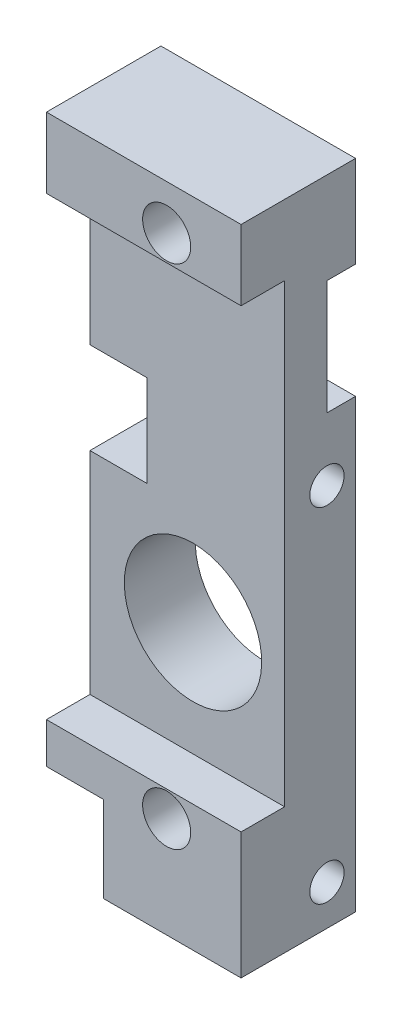
ISO-10303-21;
HEADER;
FILE_DESCRIPTION(('STEP AP214'),'2;1');
FILE_NAME('part.step','',(''),(''),'','','');
FILE_SCHEMA(('AUTOMOTIVE_DESIGN { 1 0 10303 214 1 1 1 1 }'));
ENDSEC;
DATA;
#1=APPLICATION_CONTEXT('core data for automotive mechanical design processes');
#2=APPLICATION_PROTOCOL_DEFINITION('international standard','automotive_design',2000,#1);
#3=PRODUCT_CONTEXT('',#1,'mechanical');
#4=PRODUCT('Part','Part','',(#3));
#5=PRODUCT_RELATED_PRODUCT_CATEGORY('part','',(#4));
#6=PRODUCT_DEFINITION_FORMATION('','',#4);
#7=PRODUCT_DEFINITION_CONTEXT('part definition',#1,'design');
#8=PRODUCT_DEFINITION('design','',#6,#7);
#9=PRODUCT_DEFINITION_SHAPE('','',#8);
#10=(LENGTH_UNIT() NAMED_UNIT(*) SI_UNIT(.MILLI.,.METRE.));
#11=(NAMED_UNIT(*) PLANE_ANGLE_UNIT() SI_UNIT($,.RADIAN.));
#12=(NAMED_UNIT(*) SI_UNIT($,.STERADIAN.) SOLID_ANGLE_UNIT());
#13=UNCERTAINTY_MEASURE_WITH_UNIT(LENGTH_MEASURE(1.E-05),#10,'distance_accuracy_value','');
#14=(GEOMETRIC_REPRESENTATION_CONTEXT(3) GLOBAL_UNCERTAINTY_ASSIGNED_CONTEXT((#13)) GLOBAL_UNIT_ASSIGNED_CONTEXT((#10,
#11,#12)) REPRESENTATION_CONTEXT('',''));
#15=CARTESIAN_POINT('',(0.,0.,0.));
#16=DIRECTION('',(0.,0.,1.));
#17=DIRECTION('',(1.,0.,0.));
#18=AXIS2_PLACEMENT_3D('',#15,#16,#17);
#19=CARTESIAN_POINT('',(-9.,36.,-2.49999999999999));
#20=DIRECTION('',(0.,0.,-1.));
#21=DIRECTION('',(0.,1.,0.));
#22=AXIS2_PLACEMENT_3D('',#19,#20,#21);
#23=PLANE('',#22);
#24=CARTESIAN_POINT('',(1.5,-12.2,-2.5));
#25=DIRECTION('',(0.,0.,-1.));
#26=DIRECTION('',(0.,1.,0.));
#27=AXIS2_PLACEMENT_3D('',#24,#25,#26);
#28=CIRCLE('',#27,3.5);
#29=CARTESIAN_POINT('',(1.5,-8.7,-2.5));
#30=VERTEX_POINT('',#29);
#31=EDGE_CURVE('E380',#30,#30,#28,.T.);
#32=ORIENTED_EDGE('',*,*,#31,.F.);
#33=EDGE_LOOP('',(#32));
#34=FACE_BOUND('',#33,.T.);
#35=DIRECTION('',(1.,0.,0.));
#36=VECTOR('',#35,1.);
#37=CARTESIAN_POINT('',(-9.,17.9999999999999,-2.5));
#38=LINE('',#37,#36);
#39=CARTESIAN_POINT('',(-9.,17.9999999999999,-2.5));
#40=VERTEX_POINT('',#39);
#41=CARTESIAN_POINT('',(8.,17.9999999999999,-2.5));
#42=VERTEX_POINT('',#41);
#43=EDGE_CURVE('E304',#40,#42,#38,.T.);
#44=ORIENTED_EDGE('',*,*,#43,.T.);
#45=DIRECTION('',(0.,1.,0.));
#46=VECTOR('',#45,1.);
#47=CARTESIAN_POINT('',(8.,36.,-2.49999999999999));
#48=LINE('',#47,#46);
#49=CARTESIAN_POINT('',(8.,-21.,-2.5));
#50=VERTEX_POINT('',#49);
#51=EDGE_CURVE('E252',#50,#42,#48,.T.);
#52=ORIENTED_EDGE('',*,*,#51,.F.);
#53=DIRECTION('',(1.,0.,0.));
#54=VECTOR('',#53,1.);
#55=CARTESIAN_POINT('',(-9.,-21.,-2.5));
#56=LINE('',#55,#54);
#57=CARTESIAN_POINT('',(-4.,-21.,-2.5));
#58=VERTEX_POINT('',#57);
#59=EDGE_CURVE('E197',#58,#50,#56,.T.);
#60=ORIENTED_EDGE('',*,*,#59,.F.);
#61=DIRECTION('',(0.,-1.,0.));
#62=VECTOR('',#61,1.);
#63=CARTESIAN_POINT('',(-4.,-13.5,-2.5));
#64=LINE('',#63,#62);
#65=CARTESIAN_POINT('',(-4.,-13.5,-2.5));
#66=VERTEX_POINT('',#65);
#67=EDGE_CURVE('E320',#66,#58,#64,.T.);
#68=ORIENTED_EDGE('',*,*,#67,.F.);
#69=DIRECTION('',(1.,0.,0.));
#70=VECTOR('',#69,1.);
#71=CARTESIAN_POINT('',(-4.,-13.5,-2.5));
#72=LINE('',#71,#70);
#73=CARTESIAN_POINT('',(-9.,-13.5,-2.5));
#74=VERTEX_POINT('',#73);
#75=EDGE_CURVE('E223',#74,#66,#72,.T.);
#76=ORIENTED_EDGE('',*,*,#75,.F.);
#77=DIRECTION('',(0.,1.,0.));
#78=VECTOR('',#77,1.);
#79=CARTESIAN_POINT('',(-9.,36.,-2.49999999999999));
#80=LINE('',#79,#78);
#81=CARTESIAN_POINT('',(-9.,8.5,-2.5));
#82=VERTEX_POINT('',#81);
#83=EDGE_CURVE('E182',#74,#82,#80,.T.);
#84=ORIENTED_EDGE('',*,*,#83,.T.);
#85=DIRECTION('',(-1.,0.,0.));
#86=VECTOR('',#85,1.);
#87=CARTESIAN_POINT('',(-4.,8.5,-2.5));
#88=LINE('',#87,#86);
#89=CARTESIAN_POINT('',(-4.,8.5,-2.5));
#90=VERTEX_POINT('',#89);
#91=EDGE_CURVE('E213',#90,#82,#88,.T.);
#92=ORIENTED_EDGE('',*,*,#91,.F.);
#93=DIRECTION('',(0.,-1.,0.));
#94=VECTOR('',#93,1.);
#95=CARTESIAN_POINT('',(-4.,16.5,-2.49999999999999));
#96=LINE('',#95,#94);
#97=CARTESIAN_POINT('',(-4.,16.5,-2.49999999999999));
#98=VERTEX_POINT('',#97);
#99=EDGE_CURVE('E208',#98,#90,#96,.T.);
#100=ORIENTED_EDGE('',*,*,#99,.F.);
#101=DIRECTION('',(1.,0.,0.));
#102=VECTOR('',#101,1.);
#103=CARTESIAN_POINT('',(-4.,16.5,-2.49999999999999));
#104=LINE('',#103,#102);
#105=CARTESIAN_POINT('',(-9.,16.5,-2.49999999999999));
#106=VERTEX_POINT('',#105);
#107=EDGE_CURVE('E230',#106,#98,#104,.T.);
#108=ORIENTED_EDGE('',*,*,#107,.F.);
#109=EDGE_CURVE('E179',#106,#40,#80,.T.);
#110=ORIENTED_EDGE('',*,*,#109,.T.);
#111=EDGE_LOOP('',(#44,#52,#60,#68,#76,#84,#92,#100,#108,#110));
#112=FACE_BOUND('',#111,.T.);
#113=CARTESIAN_POINT('',(0.,0.,-2.5));
#114=DIRECTION('',(0.,0.,-1.));
#115=DIRECTION('',(0.,1.,0.));
#116=AXIS2_PLACEMENT_3D('',#113,#114,#115);
#117=CIRCLE('',#116,6.00000000001402);
#118=CARTESIAN_POINT('',(0.,6.00000000001394,-2.5));
#119=VERTEX_POINT('',#118);
#120=EDGE_CURVE('E321',#119,#119,#117,.T.);
#121=ORIENTED_EDGE('',*,*,#120,.F.);
#122=EDGE_LOOP('',(#121));
#123=FACE_BOUND('',#122,.T.);
#124=ADVANCED_FACE('F30',(#34,#112,#123),#23,.T.);
#125=CARTESIAN_POINT('',(-9.,36.,7.50000000000001));
#126=DIRECTION('',(0.,0.,1.));
#127=DIRECTION('',(0.,-1.,0.));
#128=AXIS2_PLACEMENT_3D('',#125,#126,#127);
#129=PLANE('',#128);
#130=CARTESIAN_POINT('',(1.5,32.0999999999999,7.50000000000002));
#131=DIRECTION('',(0.,0.,-1.));
#132=DIRECTION('',(0.,1.,0.));
#133=AXIS2_PLACEMENT_3D('',#130,#131,#132);
#134=CIRCLE('',#133,2.1);
#135=CARTESIAN_POINT('',(1.5,34.1999999999999,7.50000000000002));
#136=VERTEX_POINT('',#135);
#137=EDGE_CURVE('E357',#136,#136,#134,.T.);
#138=ORIENTED_EDGE('',*,*,#137,.T.);
#139=EDGE_LOOP('',(#138));
#140=FACE_BOUND('',#139,.T.);
#141=DIRECTION('',(1.,0.,0.));
#142=VECTOR('',#141,1.);
#143=CARTESIAN_POINT('',(-9.,29.8499999999984,7.50000000000001));
#144=LINE('',#143,#142);
#145=CARTESIAN_POINT('',(-9.,29.8499999999984,7.50000000000001));
#146=VERTEX_POINT('',#145);
#147=CARTESIAN_POINT('',(8.,29.8499999999984,7.50000000000001));
#148=VERTEX_POINT('',#147);
#149=EDGE_CURVE('E335',#146,#148,#144,.T.);
#150=ORIENTED_EDGE('',*,*,#149,.T.);
#151=DIRECTION('',(0.,-1.,0.));
#152=VECTOR('',#151,1.);
#153=CARTESIAN_POINT('',(8.,36.,7.50000000000001));
#154=LINE('',#153,#152);
#155=CARTESIAN_POINT('',(8.,36.,7.50000000000001));
#156=VERTEX_POINT('',#155);
#157=EDGE_CURVE('E246',#156,#148,#154,.T.);
#158=ORIENTED_EDGE('',*,*,#157,.F.);
#159=DIRECTION('',(1.,0.,0.));
#160=VECTOR('',#159,1.);
#161=CARTESIAN_POINT('',(-9.,36.,7.50000000000001));
#162=LINE('',#161,#160);
#163=CARTESIAN_POINT('',(-9.,36.,7.50000000000001));
#164=VERTEX_POINT('',#163);
#165=EDGE_CURVE('E11',#164,#156,#162,.T.);
#166=ORIENTED_EDGE('',*,*,#165,.F.);
#167=DIRECTION('',(0.,-1.,0.));
#168=VECTOR('',#167,1.);
#169=CARTESIAN_POINT('',(-9.,36.,7.50000000000001));
#170=LINE('',#169,#168);
#171=EDGE_CURVE('E180',#164,#146,#170,.T.);
#172=ORIENTED_EDGE('',*,*,#171,.T.);
#173=EDGE_LOOP('',(#150,#158,#166,#172));
#174=FACE_BOUND('',#173,.T.);
#175=ADVANCED_FACE('F387',(#140,#174),#129,.T.);
#176=CARTESIAN_POINT('',(-9.,-21.,7.5));
#177=DIRECTION('',(1.,0.,0.));
#178=DIRECTION('',(0.,0.,-1.));
#179=AXIS2_PLACEMENT_3D('',#176,#177,#178);
#180=PLANE('',#179);
#181=DIRECTION('',(0.,-1.,0.));
#182=VECTOR('',#181,1.);
#183=CARTESIAN_POINT('',(-9.,27.9999999999999,0.));
#184=LINE('',#183,#182);
#185=CARTESIAN_POINT('',(-9.,27.9999999999999,0.));
#186=VERTEX_POINT('',#185);
#187=CARTESIAN_POINT('',(-9.,17.9999999999999,0.));
#188=VERTEX_POINT('',#187);
#189=EDGE_CURVE('E162',#186,#188,#184,.T.);
#190=ORIENTED_EDGE('',*,*,#189,.T.);
#191=DIRECTION('',(0.,0.,-1.));
#192=VECTOR('',#191,1.);
#193=CARTESIAN_POINT('',(-9.,17.9999999999999,-2.5));
#194=LINE('',#193,#192);
#195=EDGE_CURVE('E172',#188,#40,#194,.T.);
#196=ORIENTED_EDGE('',*,*,#195,.T.);
#197=ORIENTED_EDGE('',*,*,#109,.F.);
#198=DIRECTION('',(0.,0.,-1.));
#199=VECTOR('',#198,1.);
#200=CARTESIAN_POINT('',(-9.,16.5,7.50000000000002));
#201=LINE('',#200,#199);
#202=CARTESIAN_POINT('',(-9.,16.5,3.70000000000004));
#203=VERTEX_POINT('',#202);
#204=EDGE_CURVE('E235',#203,#106,#201,.T.);
#205=ORIENTED_EDGE('',*,*,#204,.F.);
#206=DIRECTION('',(0.,1.,0.));
#207=VECTOR('',#206,1.);
#208=CARTESIAN_POINT('',(-9.,29.8499999999984,3.70000000000004));
#209=LINE('',#208,#207);
#210=CARTESIAN_POINT('',(-9.,29.8499999999984,3.70000000000004));
#211=VERTEX_POINT('',#210);
#212=EDGE_CURVE('E300',#203,#211,#209,.T.);
#213=ORIENTED_EDGE('',*,*,#212,.T.);
#214=DIRECTION('',(0.,0.,1.));
#215=VECTOR('',#214,1.);
#216=CARTESIAN_POINT('',(-9.,29.8499999999984,7.50000000000001));
#217=LINE('',#216,#215);
#218=EDGE_CURVE('E331',#211,#146,#217,.T.);
#219=ORIENTED_EDGE('',*,*,#218,.T.);
#220=ORIENTED_EDGE('',*,*,#171,.F.);
#221=DIRECTION('',(0.,0.,1.));
#222=VECTOR('',#221,1.);
#223=CARTESIAN_POINT('',(-9.,36.,7.50000000000001));
#224=LINE('',#223,#222);
#225=CARTESIAN_POINT('',(-9.,36.,-2.49999999999999));
#226=VERTEX_POINT('',#225);
#227=EDGE_CURVE('E178',#226,#164,#224,.T.);
#228=ORIENTED_EDGE('',*,*,#227,.F.);
#229=CARTESIAN_POINT('',(-9.,27.9999999999999,-2.5));
#230=VERTEX_POINT('',#229);
#231=EDGE_CURVE('E169',#230,#226,#80,.T.);
#232=ORIENTED_EDGE('',*,*,#231,.F.);
#233=DIRECTION('',(0.,0.,1.));
#234=VECTOR('',#233,1.);
#235=CARTESIAN_POINT('',(-9.,27.9999999999999,-2.5));
#236=LINE('',#235,#234);
#237=EDGE_CURVE('E155',#230,#186,#236,.T.);
#238=ORIENTED_EDGE('',*,*,#237,.T.);
#239=EDGE_LOOP('',(#190,#196,#197,#205,#213,#219,#220,#228,#232,#238));
#240=FACE_BOUND('',#239,.T.);
#241=ADVANCED_FACE('F175',(#240),#180,.F.);
#242=CARTESIAN_POINT('',(1.5,-12.2,7.50000000000001));
#243=DIRECTION('',(0.,0.,-1.));
#244=DIRECTION('',(0.,1.,0.));
#245=AXIS2_PLACEMENT_3D('',#242,#243,#244);
#246=CIRCLE('',#245,2.1);
#247=CARTESIAN_POINT('',(1.5,-10.1,7.50000000000001));
#248=VERTEX_POINT('',#247);
#249=EDGE_CURVE('E371',#248,#248,#246,.T.);
#250=ORIENTED_EDGE('',*,*,#249,.T.);
#251=EDGE_LOOP('',(#250));
#252=FACE_BOUND('',#251,.T.);
#253=DIRECTION('',(1.,0.,0.));
#254=VECTOR('',#253,1.);
#255=CARTESIAN_POINT('',(-9.,-9.95000000000155,7.50000000000001));
#256=LINE('',#255,#254);
#257=CARTESIAN_POINT('',(-9.,-9.95000000000155,7.50000000000001));
#258=VERTEX_POINT('',#257);
#259=CARTESIAN_POINT('',(8.,-9.95000000000155,7.50000000000001));
#260=VERTEX_POINT('',#259);
#261=EDGE_CURVE('E267',#258,#260,#256,.T.);
#262=ORIENTED_EDGE('',*,*,#261,.F.);
#263=CARTESIAN_POINT('',(-9.,-13.5,7.5));
#264=VERTEX_POINT('',#263);
#265=EDGE_CURVE('E185',#258,#264,#170,.T.);
#266=ORIENTED_EDGE('',*,*,#265,.T.);
#267=DIRECTION('',(1.,0.,0.));
#268=VECTOR('',#267,1.);
#269=CARTESIAN_POINT('',(-4.,-13.5,7.50000000000001));
#270=LINE('',#269,#268);
#271=CARTESIAN_POINT('',(-4.,-13.5,7.50000000000001));
#272=VERTEX_POINT('',#271);
#273=EDGE_CURVE('E227',#264,#272,#270,.T.);
#274=ORIENTED_EDGE('',*,*,#273,.T.);
#275=DIRECTION('',(0.,-1.,0.));
#276=VECTOR('',#275,1.);
#277=CARTESIAN_POINT('',(-4.,-13.5,7.50000000000001));
#278=LINE('',#277,#276);
#279=CARTESIAN_POINT('',(-4.,-21.,7.50000000000001));
#280=VERTEX_POINT('',#279);
#281=EDGE_CURVE('E273',#272,#280,#278,.T.);
#282=ORIENTED_EDGE('',*,*,#281,.T.);
#283=DIRECTION('',(1.,0.,0.));
#284=VECTOR('',#283,1.);
#285=CARTESIAN_POINT('',(-9.,-21.,7.5));
#286=LINE('',#285,#284);
#287=CARTESIAN_POINT('',(8.,-21.,7.5));
#288=VERTEX_POINT('',#287);
#289=EDGE_CURVE('E194',#280,#288,#286,.T.);
#290=ORIENTED_EDGE('',*,*,#289,.T.);
#291=EDGE_CURVE('E245',#260,#288,#154,.T.);
#292=ORIENTED_EDGE('',*,*,#291,.F.);
#293=EDGE_LOOP('',(#262,#266,#274,#282,#290,#292));
#294=FACE_BOUND('',#293,.T.);
#295=ADVANCED_FACE('F32',(#252,#294),#129,.T.);
#296=CARTESIAN_POINT('',(-9.,36.,7.50000000000001));
#297=DIRECTION('',(0.,1.,0.));
#298=DIRECTION('',(0.,0.,1.));
#299=AXIS2_PLACEMENT_3D('',#296,#297,#298);
#300=PLANE('',#299);
#301=ORIENTED_EDGE('',*,*,#165,.T.);
#302=DIRECTION('',(0.,0.,1.));
#303=VECTOR('',#302,1.);
#304=CARTESIAN_POINT('',(8.,36.,7.50000000000001));
#305=LINE('',#304,#303);
#306=CARTESIAN_POINT('',(8.,36.,-2.49999999999999));
#307=VERTEX_POINT('',#306);
#308=EDGE_CURVE('E255',#307,#156,#305,.T.);
#309=ORIENTED_EDGE('',*,*,#308,.F.);
#310=DIRECTION('',(1.,0.,0.));
#311=VECTOR('',#310,1.);
#312=CARTESIAN_POINT('',(-9.,36.,-2.49999999999999));
#313=LINE('',#312,#311);
#314=EDGE_CURVE('E39',#226,#307,#313,.T.);
#315=ORIENTED_EDGE('',*,*,#314,.F.);
#316=ORIENTED_EDGE('',*,*,#227,.T.);
#317=EDGE_LOOP('',(#301,#309,#315,#316));
#318=FACE_BOUND('',#317,.T.);
#319=ADVANCED_FACE('F395',(#318),#300,.T.);
#320=CARTESIAN_POINT('',(1.5,32.0999999999999,-2.49999999999999));
#321=DIRECTION('',(0.,0.,-1.));
#322=DIRECTION('',(0.,1.,0.));
#323=AXIS2_PLACEMENT_3D('',#320,#321,#322);
#324=CIRCLE('',#323,3.5);
#325=CARTESIAN_POINT('',(1.5,35.5999999999999,-2.49999999999999));
#326=VERTEX_POINT('',#325);
#327=EDGE_CURVE('E368',#326,#326,#324,.T.);
#328=ORIENTED_EDGE('',*,*,#327,.F.);
#329=EDGE_LOOP('',(#328));
#330=FACE_BOUND('',#329,.T.);
#331=DIRECTION('',(1.,0.,0.));
#332=VECTOR('',#331,1.);
#333=CARTESIAN_POINT('',(-9.,27.9999999999999,-2.5));
#334=LINE('',#333,#332);
#335=CARTESIAN_POINT('',(8.,27.9999999999999,-2.49999999999999));
#336=VERTEX_POINT('',#335);
#337=EDGE_CURVE('E47',#230,#336,#334,.T.);
#338=ORIENTED_EDGE('',*,*,#337,.F.);
#339=ORIENTED_EDGE('',*,*,#231,.T.);
#340=ORIENTED_EDGE('',*,*,#314,.T.);
#341=EDGE_CURVE('E171',#336,#307,#48,.T.);
#342=ORIENTED_EDGE('',*,*,#341,.F.);
#343=EDGE_LOOP('',(#338,#339,#340,#342));
#344=FACE_BOUND('',#343,.T.);
#345=ADVANCED_FACE('F167',(#330,#344),#23,.T.);
#346=CARTESIAN_POINT('',(-9.,-21.,7.5));
#347=DIRECTION('',(0.,-1.,0.));
#348=DIRECTION('',(0.,0.,-1.));
#349=AXIS2_PLACEMENT_3D('',#346,#347,#348);
#350=PLANE('',#349);
#351=DIRECTION('',(0.,0.,-1.));
#352=VECTOR('',#351,1.);
#353=CARTESIAN_POINT('',(-4.,-21.,7.50000000000001));
#354=LINE('',#353,#352);
#355=EDGE_CURVE('E220',#280,#58,#354,.T.);
#356=ORIENTED_EDGE('',*,*,#355,.T.);
#357=ORIENTED_EDGE('',*,*,#59,.T.);
#358=DIRECTION('',(0.,0.,-1.));
#359=VECTOR('',#358,1.);
#360=CARTESIAN_POINT('',(8.,-21.,7.5));
#361=LINE('',#360,#359);
#362=EDGE_CURVE('E249',#288,#50,#361,.T.);
#363=ORIENTED_EDGE('',*,*,#362,.F.);
#364=ORIENTED_EDGE('',*,*,#289,.F.);
#365=EDGE_LOOP('',(#356,#357,#363,#364));
#366=FACE_BOUND('',#365,.T.);
#367=ADVANCED_FACE('F318',(#366),#350,.T.);
#368=DIRECTION('',(0.,0.,-1.));
#369=VECTOR('',#368,1.);
#370=CARTESIAN_POINT('',(-9.,-9.95000000000155,3.70000000000004));
#371=LINE('',#370,#369);
#372=CARTESIAN_POINT('',(-9.,-9.95000000000155,3.70000000000004));
#373=VERTEX_POINT('',#372);
#374=EDGE_CURVE('E340',#258,#373,#371,.T.);
#375=ORIENTED_EDGE('',*,*,#374,.T.);
#376=CARTESIAN_POINT('',(-9.,8.49999999999999,3.70000000000004));
#377=VERTEX_POINT('',#376);
#378=EDGE_CURVE('E279',#373,#377,#209,.T.);
#379=ORIENTED_EDGE('',*,*,#378,.T.);
#380=DIRECTION('',(0.,0.,-1.));
#381=VECTOR('',#380,1.);
#382=CARTESIAN_POINT('',(-9.,8.49999999999999,7.50000000000002));
#383=LINE('',#382,#381);
#384=EDGE_CURVE('E237',#377,#82,#383,.T.);
#385=ORIENTED_EDGE('',*,*,#384,.T.);
#386=ORIENTED_EDGE('',*,*,#83,.F.);
#387=DIRECTION('',(0.,0.,-1.));
#388=VECTOR('',#387,1.);
#389=CARTESIAN_POINT('',(-9.,-13.5,7.50000000000001));
#390=LINE('',#389,#388);
#391=EDGE_CURVE('E215',#264,#74,#390,.T.);
#392=ORIENTED_EDGE('',*,*,#391,.F.);
#393=ORIENTED_EDGE('',*,*,#265,.F.);
#394=EDGE_LOOP('',(#375,#379,#385,#386,#392,#393));
#395=FACE_BOUND('',#394,.T.);
#396=ADVANCED_FACE('F275',(#395),#180,.F.);
#397=CARTESIAN_POINT('',(-9.,12.5,0.));
#398=DIRECTION('',(1.,0.,0.));
#399=DIRECTION('',(0.,0.,-1.));
#400=AXIS2_PLACEMENT_3D('',#397,#398,#399);
#401=CYLINDRICAL_SURFACE('',#400,1.5);
#402=CARTESIAN_POINT('',(-4.,12.5,0.));
#403=DIRECTION('',(1.,0.,0.));
#404=DIRECTION('',(0.,0.,-1.));
#405=AXIS2_PLACEMENT_3D('',#402,#403,#404);
#406=CIRCLE('',#405,1.5);
#407=CARTESIAN_POINT('',(-4.,12.5,-1.50000000000001));
#408=VERTEX_POINT('',#407);
#409=EDGE_CURVE('E202',#408,#408,#406,.F.);
#410=ORIENTED_EDGE('',*,*,#409,.T.);
#411=EDGE_LOOP('',(#410));
#412=FACE_BOUND('',#411,.T.);
#413=CARTESIAN_POINT('',(8.,12.5,0.));
#414=DIRECTION('',(1.,0.,0.));
#415=DIRECTION('',(0.,0.,-1.));
#416=AXIS2_PLACEMENT_3D('',#413,#414,#415);
#417=CIRCLE('',#416,1.5);
#418=CARTESIAN_POINT('',(8.,12.5,-1.50000000000001));
#419=VERTEX_POINT('',#418);
#420=EDGE_CURVE('E242',#419,#419,#417,.T.);
#421=ORIENTED_EDGE('',*,*,#420,.T.);
#422=EDGE_LOOP('',(#421));
#423=FACE_BOUND('',#422,.T.);
#424=ADVANCED_FACE('F466',(#412,#423),#401,.F.);
#425=CARTESIAN_POINT('',(-9.,-17.5,0.));
#426=DIRECTION('',(1.,0.,0.));
#427=DIRECTION('',(0.,0.,-1.));
#428=AXIS2_PLACEMENT_3D('',#425,#426,#427);
#429=CYLINDRICAL_SURFACE('',#428,1.5);
#430=CARTESIAN_POINT('',(-4.,-17.5,0.));
#431=DIRECTION('',(1.,0.,0.));
#432=DIRECTION('',(0.,1.,0.));
#433=AXIS2_PLACEMENT_3D('',#430,#431,#432);
#434=CIRCLE('',#433,1.5);
#435=CARTESIAN_POINT('',(-4.,-16.,0.));
#436=VERTEX_POINT('',#435);
#437=EDGE_CURVE('E206',#436,#436,#434,.F.);
#438=ORIENTED_EDGE('',*,*,#437,.T.);
#439=EDGE_LOOP('',(#438));
#440=FACE_BOUND('',#439,.T.);
#441=CARTESIAN_POINT('',(8.,-17.5,0.));
#442=DIRECTION('',(1.,0.,0.));
#443=DIRECTION('',(0.,0.,-1.));
#444=AXIS2_PLACEMENT_3D('',#441,#442,#443);
#445=CIRCLE('',#444,1.5);
#446=CARTESIAN_POINT('',(8.,-17.5,-1.50000000000001));
#447=VERTEX_POINT('',#446);
#448=EDGE_CURVE('E204',#447,#447,#445,.T.);
#449=ORIENTED_EDGE('',*,*,#448,.T.);
#450=EDGE_LOOP('',(#449));
#451=FACE_BOUND('',#450,.T.);
#452=ADVANCED_FACE('F463',(#440,#451),#429,.F.);
#453=CARTESIAN_POINT('',(8.,-21.,7.5));
#454=DIRECTION('',(1.,0.,0.));
#455=DIRECTION('',(0.,0.,-1.));
#456=AXIS2_PLACEMENT_3D('',#453,#454,#455);
#457=PLANE('',#456);
#458=DIRECTION('',(0.,0.,-1.));
#459=VECTOR('',#458,1.);
#460=CARTESIAN_POINT('',(8.,17.9999999999999,-2.5));
#461=LINE('',#460,#459);
#462=CARTESIAN_POINT('',(8.,17.9999999999999,0.));
#463=VERTEX_POINT('',#462);
#464=EDGE_CURVE('E163',#463,#42,#461,.T.);
#465=ORIENTED_EDGE('',*,*,#464,.F.);
#466=DIRECTION('',(0.,-1.,0.));
#467=VECTOR('',#466,1.);
#468=CARTESIAN_POINT('',(8.,27.9999999999999,0.));
#469=LINE('',#468,#467);
#470=CARTESIAN_POINT('',(8.,27.9999999999999,0.));
#471=VERTEX_POINT('',#470);
#472=EDGE_CURVE('E352',#471,#463,#469,.T.);
#473=ORIENTED_EDGE('',*,*,#472,.F.);
#474=DIRECTION('',(0.,0.,1.));
#475=VECTOR('',#474,1.);
#476=CARTESIAN_POINT('',(8.,27.9999999999999,-2.5));
#477=LINE('',#476,#475);
#478=EDGE_CURVE('E355',#336,#471,#477,.T.);
#479=ORIENTED_EDGE('',*,*,#478,.F.);
#480=ORIENTED_EDGE('',*,*,#341,.T.);
#481=ORIENTED_EDGE('',*,*,#308,.T.);
#482=ORIENTED_EDGE('',*,*,#157,.T.);
#483=DIRECTION('',(0.,0.,1.));
#484=VECTOR('',#483,1.);
#485=CARTESIAN_POINT('',(8.,29.8499999999984,7.50000000000001));
#486=LINE('',#485,#484);
#487=CARTESIAN_POINT('',(8.,29.8499999999984,3.70000000000004));
#488=VERTEX_POINT('',#487);
#489=EDGE_CURVE('E338',#488,#148,#486,.T.);
#490=ORIENTED_EDGE('',*,*,#489,.F.);
#491=DIRECTION('',(0.,1.,0.));
#492=VECTOR('',#491,1.);
#493=CARTESIAN_POINT('',(8.,29.8499999999984,3.70000000000004));
#494=LINE('',#493,#492);
#495=CARTESIAN_POINT('',(8.,-9.95000000000155,3.70000000000004));
#496=VERTEX_POINT('',#495);
#497=EDGE_CURVE('E341',#496,#488,#494,.T.);
#498=ORIENTED_EDGE('',*,*,#497,.F.);
#499=DIRECTION('',(0.,0.,-1.));
#500=VECTOR('',#499,1.);
#501=CARTESIAN_POINT('',(8.,-9.95000000000155,3.70000000000004));
#502=LINE('',#501,#500);
#503=EDGE_CURVE('E307',#260,#496,#502,.T.);
#504=ORIENTED_EDGE('',*,*,#503,.F.);
#505=ORIENTED_EDGE('',*,*,#291,.T.);
#506=ORIENTED_EDGE('',*,*,#362,.T.);
#507=ORIENTED_EDGE('',*,*,#51,.T.);
#508=EDGE_LOOP('',(#465,#473,#479,#480,#481,#482,#490,#498,#504,#505,#506,#507));
#509=FACE_BOUND('',#508,.T.);
#510=ORIENTED_EDGE('',*,*,#420,.F.);
#511=EDGE_LOOP('',(#510));
#512=FACE_BOUND('',#511,.T.);
#513=ORIENTED_EDGE('',*,*,#448,.F.);
#514=EDGE_LOOP('',(#513));
#515=FACE_BOUND('',#514,.T.);
#516=ADVANCED_FACE('F311',(#509,#512,#515),#457,.T.);
#517=CARTESIAN_POINT('',(-4.,16.5,7.50000000000002));
#518=DIRECTION('',(1.,0.,0.));
#519=DIRECTION('',(0.,0.,-1.));
#520=AXIS2_PLACEMENT_3D('',#517,#518,#519);
#521=PLANE('',#520);
#522=DIRECTION('',(0.,0.,-1.));
#523=VECTOR('',#522,1.);
#524=CARTESIAN_POINT('',(-4.,8.49999999999999,7.50000000000002));
#525=LINE('',#524,#523);
#526=CARTESIAN_POINT('',(-4.,8.49999999999999,3.70000000000004));
#527=VERTEX_POINT('',#526);
#528=EDGE_CURVE('E233',#527,#90,#525,.T.);
#529=ORIENTED_EDGE('',*,*,#528,.F.);
#530=DIRECTION('',(0.,1.,0.));
#531=VECTOR('',#530,1.);
#532=CARTESIAN_POINT('',(-4.,16.5,3.70000000000004));
#533=LINE('',#532,#531);
#534=CARTESIAN_POINT('',(-4.,16.5,3.70000000000004));
#535=VERTEX_POINT('',#534);
#536=EDGE_CURVE('E55',#527,#535,#533,.T.);
#537=ORIENTED_EDGE('',*,*,#536,.T.);
#538=DIRECTION('',(0.,0.,-1.));
#539=VECTOR('',#538,1.);
#540=CARTESIAN_POINT('',(-4.,16.5,7.50000000000002));
#541=LINE('',#540,#539);
#542=EDGE_CURVE('E205',#535,#98,#541,.T.);
#543=ORIENTED_EDGE('',*,*,#542,.T.);
#544=ORIENTED_EDGE('',*,*,#99,.T.);
#545=EDGE_LOOP('',(#529,#537,#543,#544));
#546=FACE_BOUND('',#545,.T.);
#547=ORIENTED_EDGE('',*,*,#409,.F.);
#548=EDGE_LOOP('',(#547));
#549=FACE_BOUND('',#548,.T.);
#550=ADVANCED_FACE('F290',(#546,#549),#521,.F.);
#551=CARTESIAN_POINT('',(-4.,16.5,7.50000000000002));
#552=DIRECTION('',(0.,1.,0.));
#553=DIRECTION('',(0.,0.,1.));
#554=AXIS2_PLACEMENT_3D('',#551,#552,#553);
#555=PLANE('',#554);
#556=ORIENTED_EDGE('',*,*,#542,.F.);
#557=DIRECTION('',(-1.,0.,0.));
#558=VECTOR('',#557,1.);
#559=CARTESIAN_POINT('',(-4.,16.5,3.70000000000004));
#560=LINE('',#559,#558);
#561=EDGE_CURVE('E297',#535,#203,#560,.T.);
#562=ORIENTED_EDGE('',*,*,#561,.T.);
#563=ORIENTED_EDGE('',*,*,#204,.T.);
#564=ORIENTED_EDGE('',*,*,#107,.T.);
#565=EDGE_LOOP('',(#556,#562,#563,#564));
#566=FACE_BOUND('',#565,.T.);
#567=ADVANCED_FACE('F295',(#566),#555,.F.);
#568=CARTESIAN_POINT('',(-4.,8.49999999999999,7.50000000000002));
#569=DIRECTION('',(0.,-1.,0.));
#570=DIRECTION('',(0.,0.,-1.));
#571=AXIS2_PLACEMENT_3D('',#568,#569,#570);
#572=PLANE('',#571);
#573=ORIENTED_EDGE('',*,*,#384,.F.);
#574=DIRECTION('',(1.,0.,0.));
#575=VECTOR('',#574,1.);
#576=CARTESIAN_POINT('',(-4.,8.49999999999999,3.70000000000004));
#577=LINE('',#576,#575);
#578=EDGE_CURVE('E282',#377,#527,#577,.T.);
#579=ORIENTED_EDGE('',*,*,#578,.T.);
#580=ORIENTED_EDGE('',*,*,#528,.T.);
#581=ORIENTED_EDGE('',*,*,#91,.T.);
#582=EDGE_LOOP('',(#573,#579,#580,#581));
#583=FACE_BOUND('',#582,.T.);
#584=ADVANCED_FACE('F281',(#583),#572,.F.);
#585=CARTESIAN_POINT('',(-4.,-13.5,7.50000000000001));
#586=DIRECTION('',(1.,0.,0.));
#587=DIRECTION('',(0.,1.,0.));
#588=AXIS2_PLACEMENT_3D('',#585,#586,#587);
#589=PLANE('',#588);
#590=ORIENTED_EDGE('',*,*,#67,.T.);
#591=ORIENTED_EDGE('',*,*,#355,.F.);
#592=ORIENTED_EDGE('',*,*,#281,.F.);
#593=DIRECTION('',(0.,0.,-1.));
#594=VECTOR('',#593,1.);
#595=CARTESIAN_POINT('',(-4.,-13.5,7.50000000000001));
#596=LINE('',#595,#594);
#597=EDGE_CURVE('E209',#272,#66,#596,.T.);
#598=ORIENTED_EDGE('',*,*,#597,.T.);
#599=EDGE_LOOP('',(#590,#591,#592,#598));
#600=FACE_BOUND('',#599,.T.);
#601=ORIENTED_EDGE('',*,*,#437,.F.);
#602=EDGE_LOOP('',(#601));
#603=FACE_BOUND('',#602,.T.);
#604=ADVANCED_FACE('F452',(#600,#603),#589,.F.);
#605=CARTESIAN_POINT('',(-4.,-13.5,7.50000000000001));
#606=DIRECTION('',(0.,1.,0.));
#607=DIRECTION('',(0.,0.,1.));
#608=AXIS2_PLACEMENT_3D('',#605,#606,#607);
#609=PLANE('',#608);
#610=ORIENTED_EDGE('',*,*,#75,.T.);
#611=ORIENTED_EDGE('',*,*,#597,.F.);
#612=ORIENTED_EDGE('',*,*,#273,.F.);
#613=ORIENTED_EDGE('',*,*,#391,.T.);
#614=EDGE_LOOP('',(#610,#611,#612,#613));
#615=FACE_BOUND('',#614,.T.);
#616=ADVANCED_FACE('F272',(#615),#609,.F.);
#617=CARTESIAN_POINT('',(0.,0.,7.50000000000001));
#618=DIRECTION('',(0.,0.,-1.));
#619=DIRECTION('',(0.,1.,0.));
#620=AXIS2_PLACEMENT_3D('',#617,#618,#619);
#621=CYLINDRICAL_SURFACE('',#620,6.00000000001402);
#622=CARTESIAN_POINT('',(0.,0.,3.70000000000004));
#623=DIRECTION('',(0.,0.,-1.));
#624=DIRECTION('',(0.,1.,0.));
#625=AXIS2_PLACEMENT_3D('',#622,#623,#624);
#626=CIRCLE('',#625,6.00000000001402);
#627=CARTESIAN_POINT('',(0.,6.00000000001393,3.70000000000004));
#628=VERTEX_POINT('',#627);
#629=EDGE_CURVE('E34',#628,#628,#626,.F.);
#630=ORIENTED_EDGE('',*,*,#629,.T.);
#631=EDGE_LOOP('',(#630));
#632=FACE_BOUND('',#631,.T.);
#633=ORIENTED_EDGE('',*,*,#120,.T.);
#634=EDGE_LOOP('',(#633));
#635=FACE_BOUND('',#634,.T.);
#636=ADVANCED_FACE('F442',(#632,#635),#621,.F.);
#637=CARTESIAN_POINT('',(-9.,29.8499999999984,3.70000000000004));
#638=DIRECTION('',(0.,0.,-1.));
#639=DIRECTION('',(0.,1.,0.));
#640=AXIS2_PLACEMENT_3D('',#637,#638,#639);
#641=PLANE('',#640);
#642=ORIENTED_EDGE('',*,*,#629,.F.);
#643=EDGE_LOOP('',(#642));
#644=FACE_BOUND('',#643,.T.);
#645=ORIENTED_EDGE('',*,*,#536,.F.);
#646=ORIENTED_EDGE('',*,*,#578,.F.);
#647=ORIENTED_EDGE('',*,*,#378,.F.);
#648=DIRECTION('',(1.,0.,0.));
#649=VECTOR('',#648,1.);
#650=CARTESIAN_POINT('',(-9.,-9.95000000000155,3.70000000000004));
#651=LINE('',#650,#649);
#652=EDGE_CURVE('E330',#373,#496,#651,.T.);
#653=ORIENTED_EDGE('',*,*,#652,.T.);
#654=ORIENTED_EDGE('',*,*,#497,.T.);
#655=DIRECTION('',(1.,0.,0.));
#656=VECTOR('',#655,1.);
#657=CARTESIAN_POINT('',(-9.,29.8499999999984,3.70000000000004));
#658=LINE('',#657,#656);
#659=EDGE_CURVE('E333',#211,#488,#658,.T.);
#660=ORIENTED_EDGE('',*,*,#659,.F.);
#661=ORIENTED_EDGE('',*,*,#212,.F.);
#662=ORIENTED_EDGE('',*,*,#561,.F.);
#663=EDGE_LOOP('',(#645,#646,#647,#653,#654,#660,#661,#662));
#664=FACE_BOUND('',#663,.T.);
#665=ADVANCED_FACE('F438',(#644,#664),#641,.F.);
#666=CARTESIAN_POINT('',(-9.,29.8499999999984,7.50000000000001));
#667=DIRECTION('',(0.,1.,0.));
#668=DIRECTION('',(0.,0.,1.));
#669=AXIS2_PLACEMENT_3D('',#666,#667,#668);
#670=PLANE('',#669);
#671=ORIENTED_EDGE('',*,*,#489,.T.);
#672=ORIENTED_EDGE('',*,*,#149,.F.);
#673=ORIENTED_EDGE('',*,*,#218,.F.);
#674=ORIENTED_EDGE('',*,*,#659,.T.);
#675=EDGE_LOOP('',(#671,#672,#673,#674));
#676=FACE_BOUND('',#675,.T.);
#677=ADVANCED_FACE('F435',(#676),#670,.F.);
#678=CARTESIAN_POINT('',(-9.,-9.95000000000155,3.70000000000004));
#679=DIRECTION('',(0.,-1.,0.));
#680=DIRECTION('',(0.,0.,-1.));
#681=AXIS2_PLACEMENT_3D('',#678,#679,#680);
#682=PLANE('',#681);
#683=ORIENTED_EDGE('',*,*,#503,.T.);
#684=ORIENTED_EDGE('',*,*,#652,.F.);
#685=ORIENTED_EDGE('',*,*,#374,.F.);
#686=ORIENTED_EDGE('',*,*,#261,.T.);
#687=EDGE_LOOP('',(#683,#684,#685,#686));
#688=FACE_BOUND('',#687,.T.);
#689=ADVANCED_FACE('F429',(#688),#682,.F.);
#690=CARTESIAN_POINT('',(-9.,17.9999999999999,-2.5));
#691=DIRECTION('',(0.,-1.,0.));
#692=DIRECTION('',(0.,0.,-1.));
#693=AXIS2_PLACEMENT_3D('',#690,#691,#692);
#694=PLANE('',#693);
#695=ORIENTED_EDGE('',*,*,#464,.T.);
#696=ORIENTED_EDGE('',*,*,#43,.F.);
#697=ORIENTED_EDGE('',*,*,#195,.F.);
#698=DIRECTION('',(1.,0.,0.));
#699=VECTOR('',#698,1.);
#700=CARTESIAN_POINT('',(-9.,17.9999999999999,0.));
#701=LINE('',#700,#699);
#702=EDGE_CURVE('E308',#188,#463,#701,.T.);
#703=ORIENTED_EDGE('',*,*,#702,.T.);
#704=EDGE_LOOP('',(#695,#696,#697,#703));
#705=FACE_BOUND('',#704,.T.);
#706=ADVANCED_FACE('F425',(#705),#694,.F.);
#707=CARTESIAN_POINT('',(-9.,27.9999999999999,0.));
#708=DIRECTION('',(0.,0.,1.));
#709=DIRECTION('',(0.,-1.,0.));
#710=AXIS2_PLACEMENT_3D('',#707,#708,#709);
#711=PLANE('',#710);
#712=ORIENTED_EDGE('',*,*,#472,.T.);
#713=ORIENTED_EDGE('',*,*,#702,.F.);
#714=ORIENTED_EDGE('',*,*,#189,.F.);
#715=DIRECTION('',(1.,0.,0.));
#716=VECTOR('',#715,1.);
#717=CARTESIAN_POINT('',(-9.,27.9999999999999,0.));
#718=LINE('',#717,#716);
#719=EDGE_CURVE('E157',#186,#471,#718,.T.);
#720=ORIENTED_EDGE('',*,*,#719,.T.);
#721=EDGE_LOOP('',(#712,#713,#714,#720));
#722=FACE_BOUND('',#721,.T.);
#723=ADVANCED_FACE('F428',(#722),#711,.F.);
#724=CARTESIAN_POINT('',(-9.,27.9999999999999,-2.5));
#725=DIRECTION('',(0.,1.,0.));
#726=DIRECTION('',(0.,0.,1.));
#727=AXIS2_PLACEMENT_3D('',#724,#725,#726);
#728=PLANE('',#727);
#729=ORIENTED_EDGE('',*,*,#478,.T.);
#730=ORIENTED_EDGE('',*,*,#719,.F.);
#731=ORIENTED_EDGE('',*,*,#237,.F.);
#732=ORIENTED_EDGE('',*,*,#337,.T.);
#733=EDGE_LOOP('',(#729,#730,#731,#732));
#734=FACE_BOUND('',#733,.T.);
#735=ADVANCED_FACE('F156',(#734),#728,.F.);
#736=CARTESIAN_POINT('',(1.5,32.0999999999999,-2.49999999999999));
#737=DIRECTION('',(0.,0.,-1.));
#738=DIRECTION('',(0.,1.,0.));
#739=AXIS2_PLACEMENT_3D('',#736,#737,#738);
#740=CYLINDRICAL_SURFACE('',#739,2.1);
#741=ORIENTED_EDGE('',*,*,#137,.F.);
#742=EDGE_LOOP('',(#741));
#743=FACE_BOUND('',#742,.T.);
#744=CARTESIAN_POINT('',(1.5,32.0999999999999,2.00000000000001));
#745=DIRECTION('',(0.,0.,-1.));
#746=DIRECTION('',(0.,1.,0.));
#747=AXIS2_PLACEMENT_3D('',#744,#745,#746);
#748=CIRCLE('',#747,2.1);
#749=CARTESIAN_POINT('',(1.5,34.1999999999999,2.00000000000001));
#750=VERTEX_POINT('',#749);
#751=EDGE_CURVE('E362',#750,#750,#748,.T.);
#752=ORIENTED_EDGE('',*,*,#751,.T.);
#753=EDGE_LOOP('',(#752));
#754=FACE_BOUND('',#753,.T.);
#755=ADVANCED_FACE('F416',(#743,#754),#740,.F.);
#756=CARTESIAN_POINT('',(3.6,32.0999999999999,2.00000000000001));
#757=DIRECTION('',(0.,0.,1.));
#758=DIRECTION('',(0.,-1.,0.));
#759=AXIS2_PLACEMENT_3D('',#756,#757,#758);
#760=PLANE('',#759);
#761=ORIENTED_EDGE('',*,*,#751,.F.);
#762=EDGE_LOOP('',(#761));
#763=FACE_BOUND('',#762,.T.);
#764=CARTESIAN_POINT('',(1.5,32.0999999999999,2.00000000000001));
#765=DIRECTION('',(0.,0.,-1.));
#766=DIRECTION('',(0.,1.,0.));
#767=AXIS2_PLACEMENT_3D('',#764,#765,#766);
#768=CIRCLE('',#767,3.5);
#769=CARTESIAN_POINT('',(1.5,35.5999999999999,2.00000000000001));
#770=VERTEX_POINT('',#769);
#771=EDGE_CURVE('E365',#770,#770,#768,.T.);
#772=ORIENTED_EDGE('',*,*,#771,.T.);
#773=EDGE_LOOP('',(#772));
#774=FACE_BOUND('',#773,.T.);
#775=ADVANCED_FACE('F406',(#763,#774),#760,.F.);
#776=CARTESIAN_POINT('',(1.5,32.0999999999999,-2.49999999999999));
#777=DIRECTION('',(0.,0.,-1.));
#778=DIRECTION('',(0.,1.,0.));
#779=AXIS2_PLACEMENT_3D('',#776,#777,#778);
#780=CYLINDRICAL_SURFACE('',#779,3.5);
#781=ORIENTED_EDGE('',*,*,#771,.F.);
#782=EDGE_LOOP('',(#781));
#783=FACE_BOUND('',#782,.T.);
#784=ORIENTED_EDGE('',*,*,#327,.T.);
#785=EDGE_LOOP('',(#784));
#786=FACE_BOUND('',#785,.T.);
#787=ADVANCED_FACE('F403',(#783,#786),#780,.F.);
#788=CARTESIAN_POINT('',(1.5,-12.2,-2.5));
#789=DIRECTION('',(0.,0.,-1.));
#790=DIRECTION('',(0.,1.,0.));
#791=AXIS2_PLACEMENT_3D('',#788,#789,#790);
#792=CYLINDRICAL_SURFACE('',#791,2.1);
#793=ORIENTED_EDGE('',*,*,#249,.F.);
#794=EDGE_LOOP('',(#793));
#795=FACE_BOUND('',#794,.T.);
#796=CARTESIAN_POINT('',(1.5,-12.2,2.));
#797=DIRECTION('',(0.,0.,-1.));
#798=DIRECTION('',(0.,1.,0.));
#799=AXIS2_PLACEMENT_3D('',#796,#797,#798);
#800=CIRCLE('',#799,2.1);
#801=CARTESIAN_POINT('',(1.5,-10.1,2.));
#802=VERTEX_POINT('',#801);
#803=EDGE_CURVE('E374',#802,#802,#800,.T.);
#804=ORIENTED_EDGE('',*,*,#803,.T.);
#805=EDGE_LOOP('',(#804));
#806=FACE_BOUND('',#805,.T.);
#807=ADVANCED_FACE('F405',(#795,#806),#792,.F.);
#808=CARTESIAN_POINT('',(3.6,-12.2,2.));
#809=DIRECTION('',(0.,0.,1.));
#810=DIRECTION('',(0.,-1.,0.));
#811=AXIS2_PLACEMENT_3D('',#808,#809,#810);
#812=PLANE('',#811);
#813=ORIENTED_EDGE('',*,*,#803,.F.);
#814=EDGE_LOOP('',(#813));
#815=FACE_BOUND('',#814,.T.);
#816=CARTESIAN_POINT('',(1.5,-12.2,2.));
#817=DIRECTION('',(0.,0.,-1.));
#818=DIRECTION('',(0.,1.,0.));
#819=AXIS2_PLACEMENT_3D('',#816,#817,#818);
#820=CIRCLE('',#819,3.5);
#821=CARTESIAN_POINT('',(1.5,-8.7,2.));
#822=VERTEX_POINT('',#821);
#823=EDGE_CURVE('E377',#822,#822,#820,.T.);
#824=ORIENTED_EDGE('',*,*,#823,.T.);
#825=EDGE_LOOP('',(#824));
#826=FACE_BOUND('',#825,.T.);
#827=ADVANCED_FACE('F413',(#815,#826),#812,.F.);
#828=CARTESIAN_POINT('',(1.5,-12.2,-2.5));
#829=DIRECTION('',(0.,0.,-1.));
#830=DIRECTION('',(0.,1.,0.));
#831=AXIS2_PLACEMENT_3D('',#828,#829,#830);
#832=CYLINDRICAL_SURFACE('',#831,3.5);
#833=ORIENTED_EDGE('',*,*,#823,.F.);
#834=EDGE_LOOP('',(#833));
#835=FACE_BOUND('',#834,.T.);
#836=ORIENTED_EDGE('',*,*,#31,.T.);
#837=EDGE_LOOP('',(#836));
#838=FACE_BOUND('',#837,.T.);
#839=ADVANCED_FACE('F384',(#835,#838),#832,.F.);
#840=CLOSED_SHELL('',(#124,#175,#241,#295,#319,#345,#367,#396,#424,#452,#516,#550,#567,#584,
#604,#616,#636,#665,#677,#689,#706,#723,#735,#755,#775,#787,#807,#827,#839));
#841=MANIFOLD_SOLID_BREP('B2',#840);
#842=ADVANCED_BREP_SHAPE_REPRESENTATION('',(#18,#841),#14);
#843=SHAPE_DEFINITION_REPRESENTATION(#9,#842);
ENDSEC;
END-ISO-10303-21;
